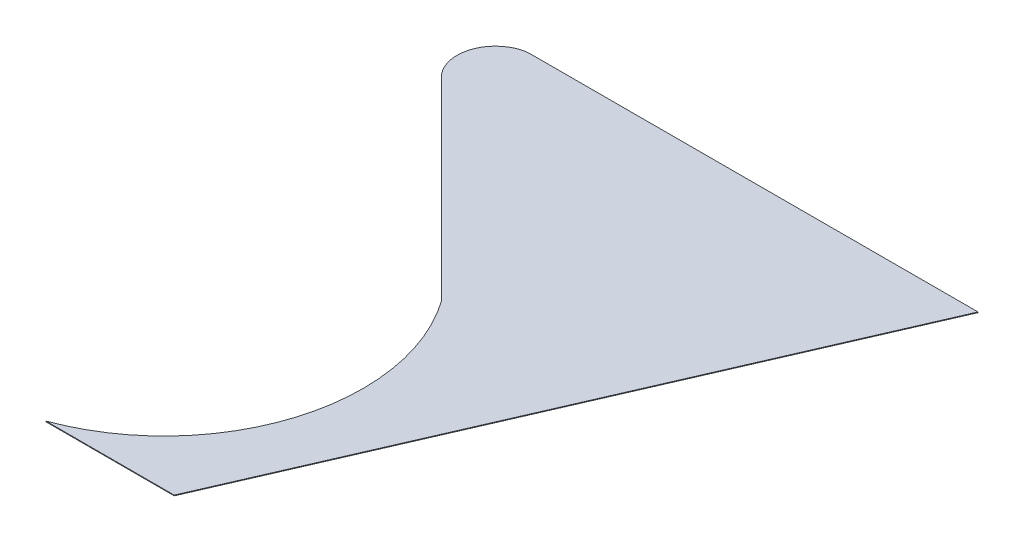
ISO-10303-21;
HEADER;
FILE_DESCRIPTION(('STEP AP214'),'2;1');
FILE_NAME('part.step','',(''),(''),'','','');
FILE_SCHEMA(('AUTOMOTIVE_DESIGN { 1 0 10303 214 1 1 1 1 }'));
ENDSEC;
DATA;
#1=APPLICATION_CONTEXT('core data for automotive mechanical design processes');
#2=APPLICATION_PROTOCOL_DEFINITION('international standard','automotive_design',2000,#1);
#3=PRODUCT_CONTEXT('',#1,'mechanical');
#4=PRODUCT('Part','Part','',(#3));
#5=PRODUCT_RELATED_PRODUCT_CATEGORY('part','',(#4));
#6=PRODUCT_DEFINITION_FORMATION('','',#4);
#7=PRODUCT_DEFINITION_CONTEXT('part definition',#1,'design');
#8=PRODUCT_DEFINITION('design','',#6,#7);
#9=PRODUCT_DEFINITION_SHAPE('','',#8);
#10=(LENGTH_UNIT() NAMED_UNIT(*) SI_UNIT(.MILLI.,.METRE.));
#11=(NAMED_UNIT(*) PLANE_ANGLE_UNIT() SI_UNIT($,.RADIAN.));
#12=(NAMED_UNIT(*) SI_UNIT($,.STERADIAN.) SOLID_ANGLE_UNIT());
#13=UNCERTAINTY_MEASURE_WITH_UNIT(LENGTH_MEASURE(1.E-05),#10,'distance_accuracy_value','');
#14=(GEOMETRIC_REPRESENTATION_CONTEXT(3) GLOBAL_UNCERTAINTY_ASSIGNED_CONTEXT((#13)) GLOBAL_UNIT_ASSIGNED_CONTEXT((#10,
#11,#12)) REPRESENTATION_CONTEXT('',''));
#15=CARTESIAN_POINT('',(0.,0.,0.));
#16=DIRECTION('',(0.,0.,1.));
#17=DIRECTION('',(1.,0.,0.));
#18=AXIS2_PLACEMENT_3D('',#15,#16,#17);
#19=CARTESIAN_POINT('',(2.41304117424245,1.4,-1.09864603277941));
#20=DIRECTION('',(0.,1.,0.));
#21=DIRECTION('',(0.,0.,1.));
#22=AXIS2_PLACEMENT_3D('',#19,#20,#21);
#23=PLANE('',#22);
#24=DIRECTION('',(1.,0.,0.));
#25=VECTOR('',#24,1.);
#26=CARTESIAN_POINT('',(2.40904555807438,1.4,-1.15597023844351));
#27=LINE('',#26,#25);
#28=CARTESIAN_POINT('',(2.40904555807438,1.4005,-1.1559702384435));
#29=VERTEX_POINT('',#28);
#30=CARTESIAN_POINT('',(3.08018164920052,1.4,-1.15597023844351));
#31=VERTEX_POINT('',#30);
#32=EDGE_CURVE('E91',#29,#31,#27,.T.);
#33=ORIENTED_EDGE('',*,*,#32,.T.);
#34=DIRECTION('',(-0.398135830493968,0.,0.917326474313741));
#35=VECTOR('',#34,1.);
#36=CARTESIAN_POINT('',(3.08018164920052,1.4,-1.15597023844351));
#37=LINE('',#36,#35);
#38=CARTESIAN_POINT('',(2.71500465844071,1.4,-0.314582712436161));
#39=VERTEX_POINT('',#38);
#40=EDGE_CURVE('E95',#31,#39,#37,.T.);
#41=ORIENTED_EDGE('',*,*,#40,.T.);
#42=DIRECTION('',(-1.,0.,0.));
#43=VECTOR('',#42,1.);
#44=CARTESIAN_POINT('',(2.71500465844071,1.4,-0.314582712436161));
#45=LINE('',#44,#43);
#46=CARTESIAN_POINT('',(2.52254651466186,1.4,-0.314582712436162));
#47=VERTEX_POINT('',#46);
#48=EDGE_CURVE('E75',#39,#47,#45,.T.);
#49=ORIENTED_EDGE('',*,*,#48,.T.);
#50=CARTESIAN_POINT('',(2.41948776915928,1.4,-0.594946642448541));
#51=DIRECTION('',(0.,-1.,0.));
#52=DIRECTION('',(0.,0.,-1.));
#53=AXIS2_PLACEMENT_3D('',#50,#51,#52);
#54=CIRCLE('',#53,0.298705604695578);
#55=CARTESIAN_POINT('',(2.66276681430527,1.4,-0.76826814852729));
#56=VERTEX_POINT('',#55);
#57=EDGE_CURVE('E72',#47,#56,#54,.F.);
#58=ORIENTED_EDGE('',*,*,#57,.T.);
#59=DIRECTION('',(-0.707106781186548,0.,-0.707106781186548));
#60=VECTOR('',#59,1.);
#61=CARTESIAN_POINT('',(2.36773322230355,1.4,-1.06330174052901));
#62=LINE('',#61,#60);
#63=CARTESIAN_POINT('',(2.36773322230355,1.4005,-1.06330174052901));
#64=VERTEX_POINT('',#63);
#65=EDGE_CURVE('E56',#56,#64,#62,.T.);
#66=ORIENTED_EDGE('',*,*,#65,.T.);
#67=CARTESIAN_POINT('',(2.41304117424245,1.4,-1.09864603277941));
#68=DIRECTION('',(0.,-1.,0.));
#69=DIRECTION('',(0.,0.,-1.));
#70=AXIS2_PLACEMENT_3D('',#67,#68,#69);
#71=CIRCLE('',#70,0.0574632883115875);
#72=EDGE_CURVE('E69',#29,#64,#71,.F.);
#73=ORIENTED_EDGE('',*,*,#72,.F.);
#74=EDGE_LOOP('',(#33,#41,#49,#58,#66,#73));
#75=FACE_BOUND('',#74,.T.);
#76=ADVANCED_FACE('F16',(#75),#23,.F.);
#77=CARTESIAN_POINT('',(2.41304117424245,1.401,-1.09864603277941));
#78=DIRECTION('',(0.,-1.,0.));
#79=DIRECTION('',(0.,0.,-1.));
#80=AXIS2_PLACEMENT_3D('',#77,#78,#79);
#81=CYLINDRICAL_SURFACE('',#80,0.0574632883115875);
#82=CARTESIAN_POINT('',(2.41304117424245,1.401,-1.09864603277941));
#83=DIRECTION('',(0.,-1.,0.));
#84=DIRECTION('',(0.,0.,-1.));
#85=AXIS2_PLACEMENT_3D('',#82,#83,#84);
#86=CIRCLE('',#85,0.0574632883115875);
#87=EDGE_CURVE('E89',#29,#64,#86,.F.);
#88=ORIENTED_EDGE('',*,*,#87,.F.);
#89=ORIENTED_EDGE('',*,*,#72,.T.);
#90=EDGE_LOOP('',(#88,#89));
#91=FACE_BOUND('',#90,.T.);
#92=ADVANCED_FACE('F87',(#91),#81,.T.);
#93=CARTESIAN_POINT('',(2.36773322230355,1.401,-1.06330174052901));
#94=DIRECTION('',(0.707106781186548,0.,-0.707106781186548));
#95=DIRECTION('',(-0.707106781186548,0.,-0.707106781186548));
#96=AXIS2_PLACEMENT_3D('',#93,#94,#95);
#97=PLANE('',#96);
#98=DIRECTION('',(0.,1.,0.));
#99=VECTOR('',#98,1.);
#100=CARTESIAN_POINT('',(2.66276681430526,1.401,-0.768268148527295));
#101=LINE('',#100,#99);
#102=CARTESIAN_POINT('',(2.66276681430526,1.401,-0.768268148527308));
#103=VERTEX_POINT('',#102);
#104=EDGE_CURVE('E60',#56,#103,#101,.T.);
#105=ORIENTED_EDGE('',*,*,#104,.T.);
#106=DIRECTION('',(0.70710678118656,0.,0.707106781186536));
#107=VECTOR('',#106,1.);
#108=CARTESIAN_POINT('',(2.36773322230355,1.401,-1.06330174052901));
#109=LINE('',#108,#107);
#110=EDGE_CURVE('E64',#64,#103,#109,.T.);
#111=ORIENTED_EDGE('',*,*,#110,.F.);
#112=ORIENTED_EDGE('',*,*,#65,.F.);
#113=EDGE_LOOP('',(#105,#111,#112));
#114=FACE_BOUND('',#113,.T.);
#115=ADVANCED_FACE('F58',(#114),#97,.F.);
#116=CARTESIAN_POINT('',(2.41948776915928,1.401,-0.594946642448541));
#117=DIRECTION('',(0.,-1.,0.));
#118=DIRECTION('',(0.,0.,-1.));
#119=AXIS2_PLACEMENT_3D('',#116,#117,#118);
#120=CYLINDRICAL_SURFACE('',#119,0.298705604695578);
#121=DIRECTION('',(0.,-1.,0.));
#122=VECTOR('',#121,1.);
#123=CARTESIAN_POINT('',(2.52254651466186,1.401,-0.314582712436163));
#124=LINE('',#123,#122);
#125=CARTESIAN_POINT('',(2.52254651466186,1.401,-0.314582712436162));
#126=VERTEX_POINT('',#125);
#127=EDGE_CURVE('E78',#47,#126,#124,.F.);
#128=ORIENTED_EDGE('',*,*,#127,.T.);
#129=CARTESIAN_POINT('',(2.41948776915928,1.401,-0.594946642448541));
#130=DIRECTION('',(0.,-1.,0.));
#131=DIRECTION('',(0.,0.,-1.));
#132=AXIS2_PLACEMENT_3D('',#129,#130,#131);
#133=CIRCLE('',#132,0.298705604695578);
#134=EDGE_CURVE('E82',#103,#126,#133,.T.);
#135=ORIENTED_EDGE('',*,*,#134,.F.);
#136=ORIENTED_EDGE('',*,*,#104,.F.);
#137=ORIENTED_EDGE('',*,*,#57,.F.);
#138=EDGE_LOOP('',(#128,#135,#136,#137));
#139=FACE_BOUND('',#138,.T.);
#140=ADVANCED_FACE('F80',(#139),#120,.F.);
#141=CARTESIAN_POINT('',(2.71500465844071,1.401,-0.314582712436161));
#142=DIRECTION('',(0.,0.,-1.));
#143=DIRECTION('',(-1.,0.,0.));
#144=AXIS2_PLACEMENT_3D('',#141,#142,#143);
#145=PLANE('',#144);
#146=DIRECTION('',(0.,1.,0.));
#147=VECTOR('',#146,1.);
#148=CARTESIAN_POINT('',(2.71500465844071,1.401,-0.314582712436161));
#149=LINE('',#148,#147);
#150=CARTESIAN_POINT('',(2.71500465844071,1.401,-0.314582712436161));
#151=VERTEX_POINT('',#150);
#152=EDGE_CURVE('E97',#39,#151,#149,.T.);
#153=ORIENTED_EDGE('',*,*,#152,.T.);
#154=DIRECTION('',(1.,0.,0.));
#155=VECTOR('',#154,1.);
#156=CARTESIAN_POINT('',(2.41304117424245,1.401,-0.314582712436161));
#157=LINE('',#156,#155);
#158=EDGE_CURVE('E108',#126,#151,#157,.T.);
#159=ORIENTED_EDGE('',*,*,#158,.F.);
#160=ORIENTED_EDGE('',*,*,#127,.F.);
#161=ORIENTED_EDGE('',*,*,#48,.F.);
#162=EDGE_LOOP('',(#153,#159,#160,#161));
#163=FACE_BOUND('',#162,.T.);
#164=ADVANCED_FACE('F114',(#163),#145,.F.);
#165=CARTESIAN_POINT('',(3.08018164920052,1.401,-1.15597023844351));
#166=DIRECTION('',(-0.917326474313741,0.,-0.398135830493968));
#167=DIRECTION('',(-0.398135830493968,0.,0.917326474313741));
#168=AXIS2_PLACEMENT_3D('',#165,#166,#167);
#169=PLANE('',#168);
#170=DIRECTION('',(0.,1.,0.));
#171=VECTOR('',#170,1.);
#172=CARTESIAN_POINT('',(3.08018164920052,1.401,-1.15597023844351));
#173=LINE('',#172,#171);
#174=CARTESIAN_POINT('',(3.08018164920052,1.401,-1.15597023844351));
#175=VERTEX_POINT('',#174);
#176=EDGE_CURVE('E34',#31,#175,#173,.T.);
#177=ORIENTED_EDGE('',*,*,#176,.T.);
#178=DIRECTION('',(0.398135830493965,0.,-0.917326474313742));
#179=VECTOR('',#178,1.);
#180=CARTESIAN_POINT('',(2.71500465844071,1.401,-0.314582712436161));
#181=LINE('',#180,#179);
#182=EDGE_CURVE('E25',#151,#175,#181,.T.);
#183=ORIENTED_EDGE('',*,*,#182,.F.);
#184=ORIENTED_EDGE('',*,*,#152,.F.);
#185=ORIENTED_EDGE('',*,*,#40,.F.);
#186=EDGE_LOOP('',(#177,#183,#184,#185));
#187=FACE_BOUND('',#186,.T.);
#188=ADVANCED_FACE('F96',(#187),#169,.F.);
#189=CARTESIAN_POINT('',(2.40904555807438,1.401,-1.15597023844351));
#190=DIRECTION('',(0.,0.,1.));
#191=DIRECTION('',(1.,0.,0.));
#192=AXIS2_PLACEMENT_3D('',#189,#190,#191);
#193=PLANE('',#192);
#194=ORIENTED_EDGE('',*,*,#32,.F.);
#195=DIRECTION('',(1.,0.,0.));
#196=VECTOR('',#195,1.);
#197=CARTESIAN_POINT('',(2.41304117424245,1.401,-1.15597023844351));
#198=LINE('',#197,#196);
#199=EDGE_CURVE('E11',#175,#29,#198,.F.);
#200=ORIENTED_EDGE('',*,*,#199,.F.);
#201=ORIENTED_EDGE('',*,*,#176,.F.);
#202=EDGE_LOOP('',(#194,#200,#201));
#203=FACE_BOUND('',#202,.T.);
#204=ADVANCED_FACE('F126',(#203),#193,.F.);
#205=CARTESIAN_POINT('',(2.41304117424245,1.401,-1.09864603277941));
#206=DIRECTION('',(0.,1.,0.));
#207=DIRECTION('',(0.,0.,1.));
#208=AXIS2_PLACEMENT_3D('',#205,#206,#207);
#209=PLANE('',#208);
#210=ORIENTED_EDGE('',*,*,#182,.T.);
#211=ORIENTED_EDGE('',*,*,#199,.T.);
#212=ORIENTED_EDGE('',*,*,#87,.T.);
#213=ORIENTED_EDGE('',*,*,#110,.T.);
#214=ORIENTED_EDGE('',*,*,#134,.T.);
#215=ORIENTED_EDGE('',*,*,#158,.T.);
#216=EDGE_LOOP('',(#210,#211,#212,#213,#214,#215));
#217=FACE_BOUND('',#216,.T.);
#218=ADVANCED_FACE('F118',(#217),#209,.T.);
#219=CLOSED_SHELL('',(#76,#92,#115,#140,#164,#188,#204,#218));
#220=MANIFOLD_SOLID_BREP('B1',#219);
#221=ADVANCED_BREP_SHAPE_REPRESENTATION('',(#18,#220),#14);
#222=SHAPE_DEFINITION_REPRESENTATION(#9,#221);
ENDSEC;
END-ISO-10303-21;
